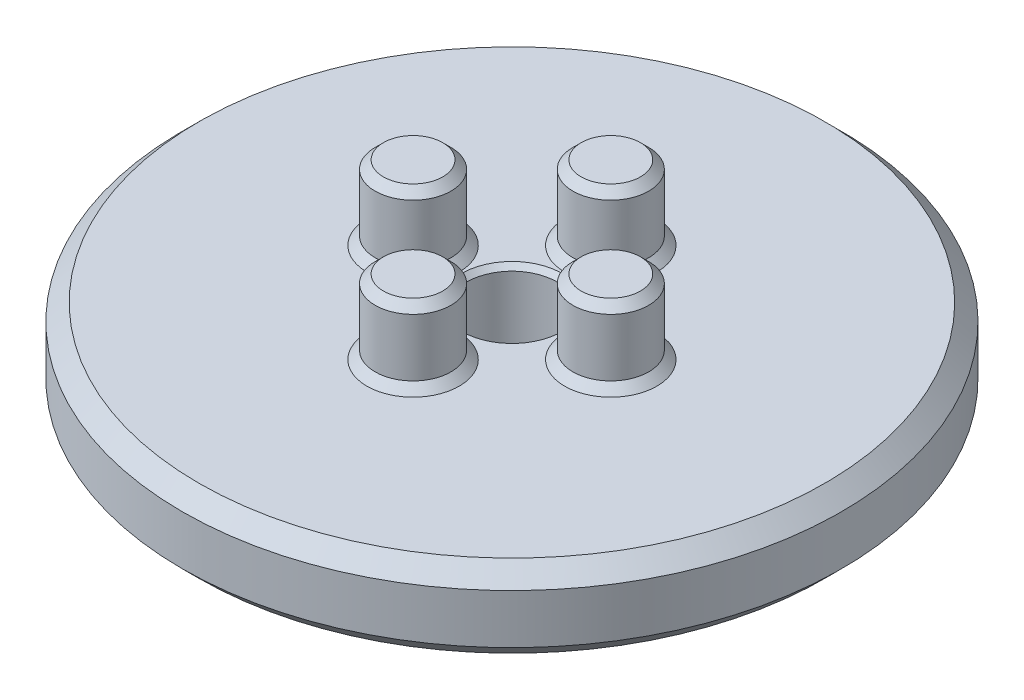
ISO-10303-21;
HEADER;
FILE_DESCRIPTION(('STEP AP214'),'2;1');
FILE_NAME('part.step','',(''),(''),'','','');
FILE_SCHEMA(('AUTOMOTIVE_DESIGN { 1 0 10303 214 1 1 1 1 }'));
ENDSEC;
DATA;
#1=APPLICATION_CONTEXT('core data for automotive mechanical design processes');
#2=APPLICATION_PROTOCOL_DEFINITION('international standard','automotive_design',2000,#1);
#3=PRODUCT_CONTEXT('',#1,'mechanical');
#4=PRODUCT('Part','Part','',(#3));
#5=PRODUCT_RELATED_PRODUCT_CATEGORY('part','',(#4));
#6=PRODUCT_DEFINITION_FORMATION('','',#4);
#7=PRODUCT_DEFINITION_CONTEXT('part definition',#1,'design');
#8=PRODUCT_DEFINITION('design','',#6,#7);
#9=PRODUCT_DEFINITION_SHAPE('','',#8);
#10=(LENGTH_UNIT() NAMED_UNIT(*) SI_UNIT(.MILLI.,.METRE.));
#11=(NAMED_UNIT(*) PLANE_ANGLE_UNIT() SI_UNIT($,.RADIAN.));
#12=(NAMED_UNIT(*) SI_UNIT($,.STERADIAN.) SOLID_ANGLE_UNIT());
#13=UNCERTAINTY_MEASURE_WITH_UNIT(LENGTH_MEASURE(1.E-05),#10,'distance_accuracy_value','');
#14=(GEOMETRIC_REPRESENTATION_CONTEXT(3) GLOBAL_UNCERTAINTY_ASSIGNED_CONTEXT((#13)) GLOBAL_UNIT_ASSIGNED_CONTEXT((#10,
#11,#12)) REPRESENTATION_CONTEXT('',''));
#15=CARTESIAN_POINT('',(0.,0.,0.));
#16=DIRECTION('',(0.,0.,1.));
#17=DIRECTION('',(1.,0.,0.));
#18=AXIS2_PLACEMENT_3D('',#15,#16,#17);
#19=CARTESIAN_POINT('',(0.,5.,0.));
#20=DIRECTION('',(0.,-1.,0.));
#21=DIRECTION('',(0.,0.,-1.));
#22=AXIS2_PLACEMENT_3D('',#19,#20,#21);
#23=CYLINDRICAL_SURFACE('',#22,20.);
#24=CARTESIAN_POINT('',(0.,1.00000000000001,0.));
#25=DIRECTION('',(0.,1.,0.));
#26=DIRECTION('',(0.,0.,1.));
#27=AXIS2_PLACEMENT_3D('',#24,#25,#26);
#28=CIRCLE('',#27,20.);
#29=CARTESIAN_POINT('',(0.,1.00000000000001,20.));
#30=VERTEX_POINT('',#29);
#31=EDGE_CURVE('E58',#30,#30,#28,.T.);
#32=ORIENTED_EDGE('',*,*,#31,.T.);
#33=EDGE_LOOP('',(#32));
#34=FACE_BOUND('',#33,.T.);
#35=CARTESIAN_POINT('',(0.,3.99999999999999,0.));
#36=DIRECTION('',(0.,1.,0.));
#37=DIRECTION('',(0.,0.,1.));
#38=AXIS2_PLACEMENT_3D('',#35,#36,#37);
#39=CIRCLE('',#38,20.);
#40=CARTESIAN_POINT('',(0.,3.99999999999999,20.));
#41=VERTEX_POINT('',#40);
#42=EDGE_CURVE('E63',#41,#41,#39,.F.);
#43=ORIENTED_EDGE('',*,*,#42,.T.);
#44=EDGE_LOOP('',(#43));
#45=FACE_BOUND('',#44,.T.);
#46=ADVANCED_FACE('F44',(#34,#45),#23,.T.);
#47=CARTESIAN_POINT('',(0.,5.,0.));
#48=DIRECTION('',(0.,1.,0.));
#49=DIRECTION('',(0.,0.,1.));
#50=AXIS2_PLACEMENT_3D('',#47,#48,#49);
#51=PLANE('',#50);
#52=CARTESIAN_POINT('',(0.,5.,0.));
#53=DIRECTION('',(0.,1.,0.));
#54=DIRECTION('',(0.,0.,1.));
#55=AXIS2_PLACEMENT_3D('',#52,#53,#54);
#56=CIRCLE('',#55,19.);
#57=CARTESIAN_POINT('',(0.,5.,19.));
#58=VERTEX_POINT('',#57);
#59=EDGE_CURVE('E10',#58,#58,#56,.T.);
#60=ORIENTED_EDGE('',*,*,#59,.T.);
#61=EDGE_LOOP('',(#60));
#62=FACE_BOUND('',#61,.T.);
#63=CARTESIAN_POINT('',(0.,5.,0.));
#64=DIRECTION('',(0.,1.,0.));
#65=DIRECTION('',(0.,0.,1.));
#66=AXIS2_PLACEMENT_3D('',#63,#64,#65);
#67=CIRCLE('',#66,3.04999999999999);
#68=CARTESIAN_POINT('',(0.,5.,3.04999999999999));
#69=VERTEX_POINT('',#68);
#70=EDGE_CURVE('E69',#69,#69,#67,.F.);
#71=ORIENTED_EDGE('',*,*,#70,.T.);
#72=EDGE_LOOP('',(#71));
#73=FACE_BOUND('',#72,.T.);
#74=CARTESIAN_POINT('',(0.,5.,-6.));
#75=DIRECTION('',(0.,1.,0.));
#76=DIRECTION('',(0.,0.,1.));
#77=AXIS2_PLACEMENT_3D('',#74,#75,#76);
#78=CIRCLE('',#77,2.79999999999999);
#79=CARTESIAN_POINT('',(0.,5.,-3.20000000000001));
#80=VERTEX_POINT('',#79);
#81=EDGE_CURVE('E89',#80,#80,#78,.F.);
#82=ORIENTED_EDGE('',*,*,#81,.T.);
#83=EDGE_LOOP('',(#82));
#84=FACE_BOUND('',#83,.T.);
#85=CARTESIAN_POINT('',(-6.,5.,0.));
#86=DIRECTION('',(0.,1.,0.));
#87=DIRECTION('',(0.,0.,1.));
#88=AXIS2_PLACEMENT_3D('',#85,#86,#87);
#89=CIRCLE('',#88,2.79999999999999);
#90=CARTESIAN_POINT('',(-6.,5.,2.79999999999999));
#91=VERTEX_POINT('',#90);
#92=EDGE_CURVE('E105',#91,#91,#89,.F.);
#93=ORIENTED_EDGE('',*,*,#92,.T.);
#94=EDGE_LOOP('',(#93));
#95=FACE_BOUND('',#94,.T.);
#96=CARTESIAN_POINT('',(0.,5.,6.));
#97=DIRECTION('',(0.,1.,0.));
#98=DIRECTION('',(0.,0.,1.));
#99=AXIS2_PLACEMENT_3D('',#96,#97,#98);
#100=CIRCLE('',#99,2.79999999999999);
#101=CARTESIAN_POINT('',(0.,5.,8.79999999999999));
#102=VERTEX_POINT('',#101);
#103=EDGE_CURVE('E121',#102,#102,#100,.F.);
#104=ORIENTED_EDGE('',*,*,#103,.T.);
#105=EDGE_LOOP('',(#104));
#106=FACE_BOUND('',#105,.T.);
#107=CARTESIAN_POINT('',(6.,5.,0.));
#108=DIRECTION('',(0.,1.,0.));
#109=DIRECTION('',(0.,0.,1.));
#110=AXIS2_PLACEMENT_3D('',#107,#108,#109);
#111=CIRCLE('',#110,2.79999999999999);
#112=CARTESIAN_POINT('',(6.,5.,2.79999999999999));
#113=VERTEX_POINT('',#112);
#114=EDGE_CURVE('E137',#113,#113,#111,.F.);
#115=ORIENTED_EDGE('',*,*,#114,.T.);
#116=EDGE_LOOP('',(#115));
#117=FACE_BOUND('',#116,.T.);
#118=ADVANCED_FACE('F174',(#62,#73,#84,#95,#106,#117),#51,.T.);
#119=CARTESIAN_POINT('',(0.,0.,0.));
#120=DIRECTION('',(0.,1.,0.));
#121=DIRECTION('',(0.,0.,1.));
#122=AXIS2_PLACEMENT_3D('',#119,#120,#121);
#123=PLANE('',#122);
#124=CARTESIAN_POINT('',(0.,0.,0.));
#125=DIRECTION('',(0.,1.,0.));
#126=DIRECTION('',(0.,0.,1.));
#127=AXIS2_PLACEMENT_3D('',#124,#125,#126);
#128=CIRCLE('',#127,19.);
#129=CARTESIAN_POINT('',(0.,0.,19.));
#130=VERTEX_POINT('',#129);
#131=EDGE_CURVE('E53',#130,#130,#128,.F.);
#132=ORIENTED_EDGE('',*,*,#131,.T.);
#133=EDGE_LOOP('',(#132));
#134=FACE_BOUND('',#133,.T.);
#135=CARTESIAN_POINT('',(0.,0.,0.));
#136=DIRECTION('',(0.,1.,0.));
#137=DIRECTION('',(0.,0.,1.));
#138=AXIS2_PLACEMENT_3D('',#135,#136,#137);
#139=CIRCLE('',#138,3.05);
#140=CARTESIAN_POINT('',(0.,0.,-3.05));
#141=VERTEX_POINT('',#140);
#142=EDGE_CURVE('E81',#141,#141,#139,.T.);
#143=ORIENTED_EDGE('',*,*,#142,.T.);
#144=EDGE_LOOP('',(#143));
#145=FACE_BOUND('',#144,.T.);
#146=ADVANCED_FACE('F181',(#134,#145),#123,.F.);
#147=CARTESIAN_POINT('',(0.,15.,0.));
#148=DIRECTION('',(0.,-1.,0.));
#149=DIRECTION('',(0.,0.,-1.));
#150=AXIS2_PLACEMENT_3D('',#147,#148,#149);
#151=CYLINDRICAL_SURFACE('',#150,2.75);
#152=CARTESIAN_POINT('',(0.,0.300000000000005,0.));
#153=DIRECTION('',(0.,1.,0.));
#154=DIRECTION('',(0.,0.,1.));
#155=AXIS2_PLACEMENT_3D('',#152,#153,#154);
#156=CIRCLE('',#155,2.75);
#157=CARTESIAN_POINT('',(0.,0.300000000000005,-2.75));
#158=VERTEX_POINT('',#157);
#159=EDGE_CURVE('E73',#158,#158,#156,.F.);
#160=ORIENTED_EDGE('',*,*,#159,.T.);
#161=EDGE_LOOP('',(#160));
#162=FACE_BOUND('',#161,.T.);
#163=CARTESIAN_POINT('',(0.,4.70000000000001,0.));
#164=DIRECTION('',(0.,1.,0.));
#165=DIRECTION('',(0.,0.,1.));
#166=AXIS2_PLACEMENT_3D('',#163,#164,#165);
#167=CIRCLE('',#166,2.75);
#168=CARTESIAN_POINT('',(0.,4.70000000000001,2.75));
#169=VERTEX_POINT('',#168);
#170=EDGE_CURVE('E77',#169,#169,#167,.T.);
#171=ORIENTED_EDGE('',*,*,#170,.T.);
#172=EDGE_LOOP('',(#171));
#173=FACE_BOUND('',#172,.T.);
#174=ADVANCED_FACE('F169',(#162,#173),#151,.F.);
#175=CARTESIAN_POINT('',(6.,9.5,0.));
#176=DIRECTION('',(0.,-1.,0.));
#177=DIRECTION('',(0.,0.,-1.));
#178=AXIS2_PLACEMENT_3D('',#175,#176,#177);
#179=CYLINDRICAL_SURFACE('',#178,2.3);
#180=CARTESIAN_POINT('',(6.,5.49999999999999,0.));
#181=DIRECTION('',(0.,1.,0.));
#182=DIRECTION('',(0.,0.,1.));
#183=AXIS2_PLACEMENT_3D('',#180,#181,#182);
#184=CIRCLE('',#183,2.3);
#185=CARTESIAN_POINT('',(6.,5.49999999999999,2.3));
#186=VERTEX_POINT('',#185);
#187=EDGE_CURVE('E141',#186,#186,#184,.T.);
#188=ORIENTED_EDGE('',*,*,#187,.T.);
#189=EDGE_LOOP('',(#188));
#190=FACE_BOUND('',#189,.T.);
#191=CARTESIAN_POINT('',(6.,8.99999999999999,0.));
#192=DIRECTION('',(0.,1.,0.));
#193=DIRECTION('',(0.,0.,1.));
#194=AXIS2_PLACEMENT_3D('',#191,#192,#193);
#195=CIRCLE('',#194,2.3);
#196=CARTESIAN_POINT('',(6.,8.99999999999999,2.3));
#197=VERTEX_POINT('',#196);
#198=EDGE_CURVE('E145',#197,#197,#195,.F.);
#199=ORIENTED_EDGE('',*,*,#198,.T.);
#200=EDGE_LOOP('',(#199));
#201=FACE_BOUND('',#200,.T.);
#202=ADVANCED_FACE('F150',(#190,#201),#179,.T.);
#203=CARTESIAN_POINT('',(6.,9.5,0.));
#204=DIRECTION('',(0.,1.,0.));
#205=DIRECTION('',(0.,0.,1.));
#206=AXIS2_PLACEMENT_3D('',#203,#204,#205);
#207=PLANE('',#206);
#208=CARTESIAN_POINT('',(6.,9.5,0.));
#209=DIRECTION('',(0.,1.,0.));
#210=DIRECTION('',(0.,0.,1.));
#211=AXIS2_PLACEMENT_3D('',#208,#209,#210);
#212=CIRCLE('',#211,1.79999999999999);
#213=CARTESIAN_POINT('',(6.,9.5,1.79999999999999));
#214=VERTEX_POINT('',#213);
#215=EDGE_CURVE('E133',#214,#214,#212,.T.);
#216=ORIENTED_EDGE('',*,*,#215,.T.);
#217=EDGE_LOOP('',(#216));
#218=FACE_BOUND('',#217,.T.);
#219=ADVANCED_FACE('F160',(#218),#207,.T.);
#220=CARTESIAN_POINT('',(6.,5.49999999999999,0.));
#221=DIRECTION('',(0.,-1.,0.));
#222=DIRECTION('',(0.,0.,-1.));
#223=AXIS2_PLACEMENT_3D('',#220,#221,#222);
#224=CONICAL_SURFACE('',#223,2.3,0.785398163397444);
#225=ORIENTED_EDGE('',*,*,#114,.F.);
#226=EDGE_LOOP('',(#225));
#227=FACE_BOUND('',#226,.T.);
#228=ORIENTED_EDGE('',*,*,#187,.F.);
#229=EDGE_LOOP('',(#228));
#230=FACE_BOUND('',#229,.T.);
#231=ADVANCED_FACE('F156',(#227,#230),#224,.T.);
#232=CARTESIAN_POINT('',(6.,9.5,0.));
#233=DIRECTION('',(0.,-1.,0.));
#234=DIRECTION('',(0.,0.,-1.));
#235=AXIS2_PLACEMENT_3D('',#232,#233,#234);
#236=CONICAL_SURFACE('',#235,1.79999999999999,0.785398163397448);
#237=ORIENTED_EDGE('',*,*,#198,.F.);
#238=EDGE_LOOP('',(#237));
#239=FACE_BOUND('',#238,.T.);
#240=ORIENTED_EDGE('',*,*,#215,.F.);
#241=EDGE_LOOP('',(#240));
#242=FACE_BOUND('',#241,.T.);
#243=ADVANCED_FACE('F152',(#239,#242),#236,.T.);
#244=CARTESIAN_POINT('',(0.,9.5,6.));
#245=DIRECTION('',(0.,-1.,0.));
#246=DIRECTION('',(0.,0.,-1.));
#247=AXIS2_PLACEMENT_3D('',#244,#245,#246);
#248=CYLINDRICAL_SURFACE('',#247,2.3);
#249=CARTESIAN_POINT('',(0.,5.49999999999999,6.));
#250=DIRECTION('',(0.,1.,0.));
#251=DIRECTION('',(0.,0.,1.));
#252=AXIS2_PLACEMENT_3D('',#249,#250,#251);
#253=CIRCLE('',#252,2.3);
#254=CARTESIAN_POINT('',(0.,5.49999999999999,8.3));
#255=VERTEX_POINT('',#254);
#256=EDGE_CURVE('E125',#255,#255,#253,.T.);
#257=ORIENTED_EDGE('',*,*,#256,.T.);
#258=EDGE_LOOP('',(#257));
#259=FACE_BOUND('',#258,.T.);
#260=CARTESIAN_POINT('',(0.,8.99999999999999,6.));
#261=DIRECTION('',(0.,1.,0.));
#262=DIRECTION('',(0.,0.,1.));
#263=AXIS2_PLACEMENT_3D('',#260,#261,#262);
#264=CIRCLE('',#263,2.3);
#265=CARTESIAN_POINT('',(0.,8.99999999999999,8.3));
#266=VERTEX_POINT('',#265);
#267=EDGE_CURVE('E129',#266,#266,#264,.F.);
#268=ORIENTED_EDGE('',*,*,#267,.T.);
#269=EDGE_LOOP('',(#268));
#270=FACE_BOUND('',#269,.T.);
#271=ADVANCED_FACE('F155',(#259,#270),#248,.T.);
#272=CARTESIAN_POINT('',(0.,9.5,6.));
#273=DIRECTION('',(0.,1.,0.));
#274=DIRECTION('',(-1.,0.,0.));
#275=AXIS2_PLACEMENT_3D('',#272,#273,#274);
#276=PLANE('',#275);
#277=CARTESIAN_POINT('',(0.,9.5,6.));
#278=DIRECTION('',(0.,1.,0.));
#279=DIRECTION('',(0.,0.,1.));
#280=AXIS2_PLACEMENT_3D('',#277,#278,#279);
#281=CIRCLE('',#280,1.79999999999999);
#282=CARTESIAN_POINT('',(0.,9.5,7.79999999999999));
#283=VERTEX_POINT('',#282);
#284=EDGE_CURVE('E117',#283,#283,#281,.T.);
#285=ORIENTED_EDGE('',*,*,#284,.T.);
#286=EDGE_LOOP('',(#285));
#287=FACE_BOUND('',#286,.T.);
#288=ADVANCED_FACE('F357',(#287),#276,.T.);
#289=CARTESIAN_POINT('',(-6.,9.5,0.));
#290=DIRECTION('',(0.,-1.,0.));
#291=DIRECTION('',(0.,0.,-1.));
#292=AXIS2_PLACEMENT_3D('',#289,#290,#291);
#293=CYLINDRICAL_SURFACE('',#292,2.3);
#294=CARTESIAN_POINT('',(-6.,5.49999999999999,0.));
#295=DIRECTION('',(0.,1.,0.));
#296=DIRECTION('',(0.,0.,1.));
#297=AXIS2_PLACEMENT_3D('',#294,#295,#296);
#298=CIRCLE('',#297,2.3);
#299=CARTESIAN_POINT('',(-6.,5.49999999999999,2.3));
#300=VERTEX_POINT('',#299);
#301=EDGE_CURVE('E109',#300,#300,#298,.T.);
#302=ORIENTED_EDGE('',*,*,#301,.T.);
#303=EDGE_LOOP('',(#302));
#304=FACE_BOUND('',#303,.T.);
#305=CARTESIAN_POINT('',(-6.,8.99999999999999,0.));
#306=DIRECTION('',(0.,1.,0.));
#307=DIRECTION('',(0.,0.,1.));
#308=AXIS2_PLACEMENT_3D('',#305,#306,#307);
#309=CIRCLE('',#308,2.3);
#310=CARTESIAN_POINT('',(-6.,8.99999999999999,2.3));
#311=VERTEX_POINT('',#310);
#312=EDGE_CURVE('E113',#311,#311,#309,.F.);
#313=ORIENTED_EDGE('',*,*,#312,.T.);
#314=EDGE_LOOP('',(#313));
#315=FACE_BOUND('',#314,.T.);
#316=ADVANCED_FACE('F347',(#304,#315),#293,.T.);
#317=CARTESIAN_POINT('',(-6.,9.5,0.));
#318=DIRECTION('',(0.,1.,0.));
#319=DIRECTION('',(0.,0.,-1.));
#320=AXIS2_PLACEMENT_3D('',#317,#318,#319);
#321=PLANE('',#320);
#322=CARTESIAN_POINT('',(-6.,9.5,0.));
#323=DIRECTION('',(0.,1.,0.));
#324=DIRECTION('',(0.,0.,1.));
#325=AXIS2_PLACEMENT_3D('',#322,#323,#324);
#326=CIRCLE('',#325,1.79999999999999);
#327=CARTESIAN_POINT('',(-6.,9.5,1.79999999999999));
#328=VERTEX_POINT('',#327);
#329=EDGE_CURVE('E101',#328,#328,#326,.T.);
#330=ORIENTED_EDGE('',*,*,#329,.T.);
#331=EDGE_LOOP('',(#330));
#332=FACE_BOUND('',#331,.T.);
#333=ADVANCED_FACE('F337',(#332),#321,.T.);
#334=CARTESIAN_POINT('',(0.,9.5,-6.));
#335=DIRECTION('',(0.,-1.,0.));
#336=DIRECTION('',(0.,0.,-1.));
#337=AXIS2_PLACEMENT_3D('',#334,#335,#336);
#338=CYLINDRICAL_SURFACE('',#337,2.3);
#339=CARTESIAN_POINT('',(0.,5.49999999999999,-6.));
#340=DIRECTION('',(0.,1.,0.));
#341=DIRECTION('',(0.,0.,1.));
#342=AXIS2_PLACEMENT_3D('',#339,#340,#341);
#343=CIRCLE('',#342,2.3);
#344=CARTESIAN_POINT('',(0.,5.49999999999999,-3.7));
#345=VERTEX_POINT('',#344);
#346=EDGE_CURVE('E93',#345,#345,#343,.T.);
#347=ORIENTED_EDGE('',*,*,#346,.T.);
#348=EDGE_LOOP('',(#347));
#349=FACE_BOUND('',#348,.T.);
#350=CARTESIAN_POINT('',(0.,8.99999999999999,-6.));
#351=DIRECTION('',(0.,1.,0.));
#352=DIRECTION('',(0.,0.,1.));
#353=AXIS2_PLACEMENT_3D('',#350,#351,#352);
#354=CIRCLE('',#353,2.3);
#355=CARTESIAN_POINT('',(0.,8.99999999999999,-3.7));
#356=VERTEX_POINT('',#355);
#357=EDGE_CURVE('E97',#356,#356,#354,.F.);
#358=ORIENTED_EDGE('',*,*,#357,.T.);
#359=EDGE_LOOP('',(#358));
#360=FACE_BOUND('',#359,.T.);
#361=ADVANCED_FACE('F327',(#349,#360),#338,.T.);
#362=CARTESIAN_POINT('',(0.,9.5,-6.));
#363=DIRECTION('',(0.,1.,0.));
#364=DIRECTION('',(1.,0.,0.));
#365=AXIS2_PLACEMENT_3D('',#362,#363,#364);
#366=PLANE('',#365);
#367=CARTESIAN_POINT('',(0.,9.5,-6.));
#368=DIRECTION('',(0.,1.,0.));
#369=DIRECTION('',(0.,0.,1.));
#370=AXIS2_PLACEMENT_3D('',#367,#368,#369);
#371=CIRCLE('',#370,1.79999999999999);
#372=CARTESIAN_POINT('',(0.,9.5,-4.20000000000001));
#373=VERTEX_POINT('',#372);
#374=EDGE_CURVE('E85',#373,#373,#371,.T.);
#375=ORIENTED_EDGE('',*,*,#374,.T.);
#376=EDGE_LOOP('',(#375));
#377=FACE_BOUND('',#376,.T.);
#378=ADVANCED_FACE('F200',(#377),#366,.T.);
#379=CARTESIAN_POINT('',(0.,5.49999999999999,6.));
#380=DIRECTION('',(0.,-1.,0.));
#381=DIRECTION('',(0.,0.,-1.));
#382=AXIS2_PLACEMENT_3D('',#379,#380,#381);
#383=CONICAL_SURFACE('',#382,2.3,0.785398163397444);
#384=ORIENTED_EDGE('',*,*,#103,.F.);
#385=EDGE_LOOP('',(#384));
#386=FACE_BOUND('',#385,.T.);
#387=ORIENTED_EDGE('',*,*,#256,.F.);
#388=EDGE_LOOP('',(#387));
#389=FACE_BOUND('',#388,.T.);
#390=ADVANCED_FACE('F193',(#386,#389),#383,.T.);
#391=CARTESIAN_POINT('',(0.,9.5,6.));
#392=DIRECTION('',(0.,-1.,0.));
#393=DIRECTION('',(0.,0.,-1.));
#394=AXIS2_PLACEMENT_3D('',#391,#392,#393);
#395=CONICAL_SURFACE('',#394,1.79999999999999,0.785398163397448);
#396=ORIENTED_EDGE('',*,*,#267,.F.);
#397=EDGE_LOOP('',(#396));
#398=FACE_BOUND('',#397,.T.);
#399=ORIENTED_EDGE('',*,*,#284,.F.);
#400=EDGE_LOOP('',(#399));
#401=FACE_BOUND('',#400,.T.);
#402=ADVANCED_FACE('F199',(#398,#401),#395,.T.);
#403=CARTESIAN_POINT('',(-6.,5.49999999999999,0.));
#404=DIRECTION('',(0.,-1.,0.));
#405=DIRECTION('',(0.,0.,-1.));
#406=AXIS2_PLACEMENT_3D('',#403,#404,#405);
#407=CONICAL_SURFACE('',#406,2.3,0.785398163397444);
#408=ORIENTED_EDGE('',*,*,#92,.F.);
#409=EDGE_LOOP('',(#408));
#410=FACE_BOUND('',#409,.T.);
#411=ORIENTED_EDGE('',*,*,#301,.F.);
#412=EDGE_LOOP('',(#411));
#413=FACE_BOUND('',#412,.T.);
#414=ADVANCED_FACE('F207',(#410,#413),#407,.T.);
#415=CARTESIAN_POINT('',(-6.,9.5,0.));
#416=DIRECTION('',(0.,-1.,0.));
#417=DIRECTION('',(0.,0.,-1.));
#418=AXIS2_PLACEMENT_3D('',#415,#416,#417);
#419=CONICAL_SURFACE('',#418,1.79999999999999,0.785398163397448);
#420=ORIENTED_EDGE('',*,*,#312,.F.);
#421=EDGE_LOOP('',(#420));
#422=FACE_BOUND('',#421,.T.);
#423=ORIENTED_EDGE('',*,*,#329,.F.);
#424=EDGE_LOOP('',(#423));
#425=FACE_BOUND('',#424,.T.);
#426=ADVANCED_FACE('F214',(#422,#425),#419,.T.);
#427=CARTESIAN_POINT('',(0.,5.49999999999999,-6.));
#428=DIRECTION('',(0.,-1.,0.));
#429=DIRECTION('',(0.,0.,-1.));
#430=AXIS2_PLACEMENT_3D('',#427,#428,#429);
#431=CONICAL_SURFACE('',#430,2.3,0.785398163397444);
#432=ORIENTED_EDGE('',*,*,#81,.F.);
#433=EDGE_LOOP('',(#432));
#434=FACE_BOUND('',#433,.T.);
#435=ORIENTED_EDGE('',*,*,#346,.F.);
#436=EDGE_LOOP('',(#435));
#437=FACE_BOUND('',#436,.T.);
#438=ADVANCED_FACE('F221',(#434,#437),#431,.T.);
#439=CARTESIAN_POINT('',(0.,9.5,-6.));
#440=DIRECTION('',(0.,-1.,0.));
#441=DIRECTION('',(0.,0.,-1.));
#442=AXIS2_PLACEMENT_3D('',#439,#440,#441);
#443=CONICAL_SURFACE('',#442,1.79999999999999,0.785398163397448);
#444=ORIENTED_EDGE('',*,*,#357,.F.);
#445=EDGE_LOOP('',(#444));
#446=FACE_BOUND('',#445,.T.);
#447=ORIENTED_EDGE('',*,*,#374,.F.);
#448=EDGE_LOOP('',(#447));
#449=FACE_BOUND('',#448,.T.);
#450=ADVANCED_FACE('F228',(#446,#449),#443,.T.);
#451=CARTESIAN_POINT('',(0.,0.,0.));
#452=DIRECTION('',(0.,-1.,0.));
#453=DIRECTION('',(0.,0.,-1.));
#454=AXIS2_PLACEMENT_3D('',#451,#452,#453);
#455=CONICAL_SURFACE('',#454,3.05,0.785398163397447);
#456=CARTESIAN_POINT('',(0.,0.300000000000005,-2.75));
#457=CARTESIAN_POINT('',(0.,0.296875000000005,-2.753125));
#458=CARTESIAN_POINT('',(0.,0.293750000000005,-2.75625));
#459=CARTESIAN_POINT('',(0.,0.287500000000005,-2.7625));
#460=CARTESIAN_POINT('',(0.,0.284375000000005,-2.765625));
#461=CARTESIAN_POINT('',(0.,0.278125000000005,-2.771875));
#462=CARTESIAN_POINT('',(0.,0.275000000000005,-2.775));
#463=CARTESIAN_POINT('',(0.,0.268750000000004,-2.78125));
#464=CARTESIAN_POINT('',(0.,0.265625000000004,-2.784375));
#465=CARTESIAN_POINT('',(0.,0.259375000000004,-2.790625));
#466=CARTESIAN_POINT('',(0.,0.256250000000004,-2.79375));
#467=CARTESIAN_POINT('',(0.,0.250000000000004,-2.8));
#468=CARTESIAN_POINT('',(0.,0.246875000000004,-2.803125));
#469=CARTESIAN_POINT('',(0.,0.240625000000004,-2.809375));
#470=CARTESIAN_POINT('',(0.,0.237500000000004,-2.8125));
#471=CARTESIAN_POINT('',(0.,0.231250000000004,-2.81875));
#472=CARTESIAN_POINT('',(0.,0.228125000000004,-2.821875));
#473=CARTESIAN_POINT('',(0.,0.221875000000004,-2.828125));
#474=CARTESIAN_POINT('',(0.,0.218750000000004,-2.83125));
#475=CARTESIAN_POINT('',(0.,0.212500000000004,-2.8375));
#476=CARTESIAN_POINT('',(0.,0.209375000000004,-2.840625));
#477=CARTESIAN_POINT('',(0.,0.203125000000003,-2.846875));
#478=CARTESIAN_POINT('',(0.,0.200000000000003,-2.85));
#479=CARTESIAN_POINT('',(0.,0.193750000000003,-2.85625));
#480=CARTESIAN_POINT('',(0.,0.190625000000003,-2.859375));
#481=CARTESIAN_POINT('',(0.,0.184375000000003,-2.865625));
#482=CARTESIAN_POINT('',(0.,0.181250000000003,-2.86875));
#483=CARTESIAN_POINT('',(0.,0.175000000000003,-2.875));
#484=CARTESIAN_POINT('',(0.,0.171875000000003,-2.878125));
#485=CARTESIAN_POINT('',(0.,0.165625000000003,-2.884375));
#486=CARTESIAN_POINT('',(0.,0.162500000000003,-2.8875));
#487=CARTESIAN_POINT('',(0.,0.156250000000003,-2.89375));
#488=CARTESIAN_POINT('',(0.,0.153125000000003,-2.896875));
#489=CARTESIAN_POINT('',(0.,0.146875000000003,-2.903125));
#490=CARTESIAN_POINT('',(0.,0.143750000000002,-2.90625));
#491=CARTESIAN_POINT('',(0.,0.137500000000002,-2.9125));
#492=CARTESIAN_POINT('',(0.,0.134375000000002,-2.915625));
#493=CARTESIAN_POINT('',(0.,0.128125000000002,-2.921875));
#494=CARTESIAN_POINT('',(0.,0.125000000000002,-2.925));
#495=CARTESIAN_POINT('',(0.,0.118750000000002,-2.93125));
#496=CARTESIAN_POINT('',(0.,0.115625000000002,-2.934375));
#497=CARTESIAN_POINT('',(0.,0.109375000000002,-2.940625));
#498=CARTESIAN_POINT('',(0.,0.106250000000002,-2.94375));
#499=CARTESIAN_POINT('',(0.,0.100000000000002,-2.95));
#500=CARTESIAN_POINT('',(0.,0.0968750000000016,-2.953125));
#501=CARTESIAN_POINT('',(0.,0.0906250000000015,-2.959375));
#502=CARTESIAN_POINT('',(0.,0.0875000000000015,-2.9625));
#503=CARTESIAN_POINT('',(0.,0.0812500000000014,-2.96875));
#504=CARTESIAN_POINT('',(0.,0.0781250000000014,-2.971875));
#505=CARTESIAN_POINT('',(0.,0.0718750000000012,-2.978125));
#506=CARTESIAN_POINT('',(0.,0.0687500000000011,-2.98125));
#507=CARTESIAN_POINT('',(0.,0.062500000000001,-2.9875));
#508=CARTESIAN_POINT('',(0.,0.059375000000001,-2.990625));
#509=CARTESIAN_POINT('',(0.,0.0531250000000009,-2.996875));
#510=CARTESIAN_POINT('',(0.,0.0500000000000009,-3.));
#511=CARTESIAN_POINT('',(0.,0.0437500000000008,-3.00625));
#512=CARTESIAN_POINT('',(0.,0.0406250000000007,-3.009375));
#513=CARTESIAN_POINT('',(0.,0.0343750000000005,-3.015625));
#514=CARTESIAN_POINT('',(0.,0.0312500000000005,-3.01875));
#515=CARTESIAN_POINT('',(0.,0.0250000000000004,-3.025));
#516=CARTESIAN_POINT('',(0.,0.0218750000000004,-3.028125));
#517=CARTESIAN_POINT('',(0.,0.0156250000000003,-3.034375));
#518=CARTESIAN_POINT('',(0.,0.0125000000000002,-3.0375));
#519=CARTESIAN_POINT('',(0.,0.00625000000000004,-3.04375));
#520=CARTESIAN_POINT('',(0.,0.00312499999999995,-3.046875));
#521=CARTESIAN_POINT('',(0.,0.,-3.05));
#522=B_SPLINE_CURVE_WITH_KNOTS('',3,(#456,#457,#458,#459,#460,#461,#462,#463,#464,#465,#466,
#467,#468,#469,#470,#471,#472,#473,#474,#475,#476,#477,#478,#479,#480,#481,#482,#483,#484,#485,
#486,#487,#488,#489,#490,#491,#492,#493,#494,#495,#496,#497,#498,#499,#500,#501,#502,#503,#504,
#505,#506,#507,#508,#509,#510,#511,#512,#513,#514,#515,#516,#517,#518,#519,#520,#521),
.UNSPECIFIED.,.F.,.F.,(4,2,2,2,2,2,2,2,2,2,2,2,2,2,2,2,2,2,2,2,2,2,2,2,2,2,2,2,2,2,2,2,4),(0.,
0.0132582521472481,0.0265165042944961,0.0397747564417439,0.053033008588992,0.06629126073624,
0.0795495128834878,0.0928077650307358,0.106066017177984,0.119324269325232,0.13258252147248,
0.145840773619728,0.159099025766976,0.172357277914224,0.185615530061472,0.198873782208719,
0.212132034355968,0.225390286503216,0.238648538650463,0.251906790797711,0.265165042944959,
0.278423295092207,0.291681547239455,0.304939799386703,0.318198051533951,0.331456303681199,
0.344714555828447,0.357972807975695,0.371231060122943,0.384489312270191,0.397747564417439,
0.411005816564687,0.424264068711935),.UNSPECIFIED.);
#523=EDGE_CURVE('BSEAM235',#158,#141,#522,.T.);
#524=ORIENTED_EDGE('',*,*,#159,.F.);
#525=ORIENTED_EDGE('',*,*,#142,.F.);
#526=ORIENTED_EDGE('',*,*,#523,.T.);
#527=ORIENTED_EDGE('',*,*,#523,.F.);
#528=EDGE_LOOP('',(#524,#526,#525,#527));
#529=FACE_BOUND('',#528,.T.);
#530=ADVANCED_FACE('F235',(#529),#455,.F.);
#531=CARTESIAN_POINT('',(0.,5.,0.));
#532=DIRECTION('',(0.,1.,0.));
#533=DIRECTION('',(0.,0.,1.));
#534=AXIS2_PLACEMENT_3D('',#531,#532,#533);
#535=CONICAL_SURFACE('',#534,3.04999999999999,0.785398163397447);
#536=ORIENTED_EDGE('',*,*,#170,.F.);
#537=EDGE_LOOP('',(#536));
#538=FACE_BOUND('',#537,.T.);
#539=ORIENTED_EDGE('',*,*,#70,.F.);
#540=EDGE_LOOP('',(#539));
#541=FACE_BOUND('',#540,.T.);
#542=ADVANCED_FACE('F242',(#538,#541),#535,.F.);
#543=CARTESIAN_POINT('',(0.,1.00000000000001,0.));
#544=DIRECTION('',(0.,1.,0.));
#545=DIRECTION('',(0.,0.,1.));
#546=AXIS2_PLACEMENT_3D('',#543,#544,#545);
#547=CONICAL_SURFACE('',#546,20.,0.78539816339745);
#548=ORIENTED_EDGE('',*,*,#131,.F.);
#549=EDGE_LOOP('',(#548));
#550=FACE_BOUND('',#549,.T.);
#551=ORIENTED_EDGE('',*,*,#31,.F.);
#552=EDGE_LOOP('',(#551));
#553=FACE_BOUND('',#552,.T.);
#554=ADVANCED_FACE('F247',(#550,#553),#547,.T.);
#555=CARTESIAN_POINT('',(0.,5.,0.));
#556=DIRECTION('',(0.,-1.,0.));
#557=DIRECTION('',(0.,0.,-1.));
#558=AXIS2_PLACEMENT_3D('',#555,#556,#557);
#559=CONICAL_SURFACE('',#558,19.,0.785398163397445);
#560=ORIENTED_EDGE('',*,*,#42,.F.);
#561=EDGE_LOOP('',(#560));
#562=FACE_BOUND('',#561,.T.);
#563=ORIENTED_EDGE('',*,*,#59,.F.);
#564=EDGE_LOOP('',(#563));
#565=FACE_BOUND('',#564,.T.);
#566=ADVANCED_FACE('F47',(#562,#565),#559,.T.);
#567=CLOSED_SHELL('',(#46,#118,#146,#174,#202,#219,#231,#243,#271,#288,#316,#333,#361,#378,#390,
#402,#414,#426,#438,#450,#530,#542,#554,#566));
#568=MANIFOLD_SOLID_BREP('B2',#567);
#569=ADVANCED_BREP_SHAPE_REPRESENTATION('',(#18,#568),#14);
#570=SHAPE_DEFINITION_REPRESENTATION(#9,#569);
ENDSEC;
END-ISO-10303-21;
